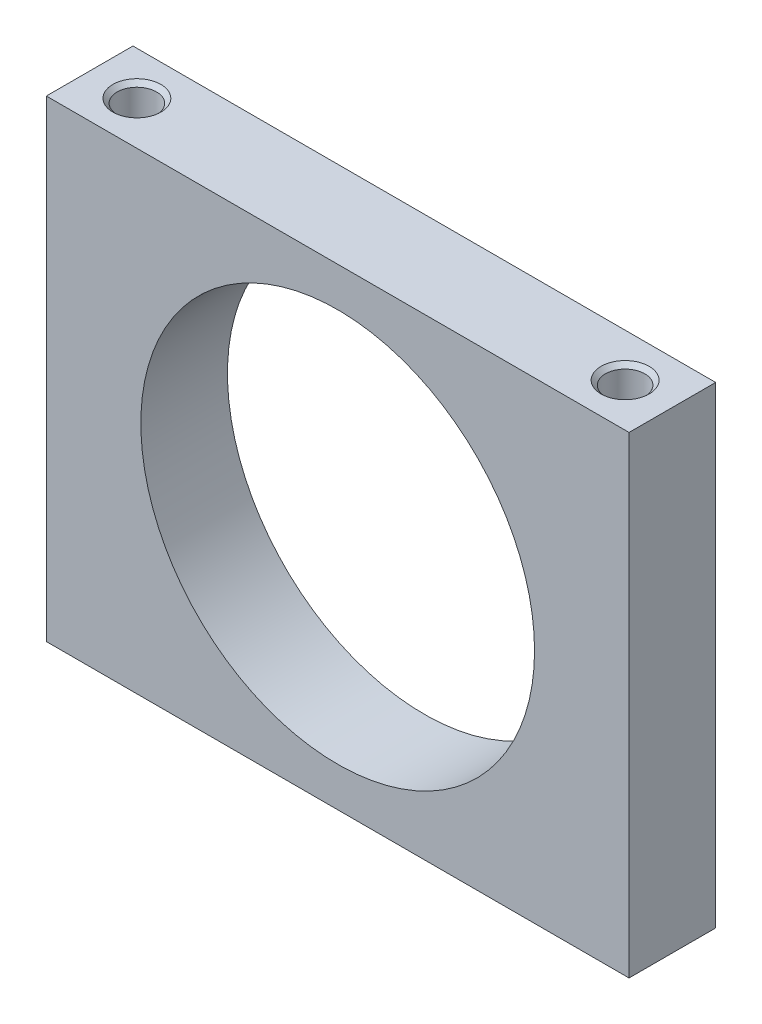
ISO-10303-21;
HEADER;
FILE_DESCRIPTION(('STEP AP214'),'2;1');
FILE_NAME('part.step','',(''),(''),'','','');
FILE_SCHEMA(('AUTOMOTIVE_DESIGN { 1 0 10303 214 1 1 1 1 }'));
ENDSEC;
DATA;
#1=APPLICATION_CONTEXT('core data for automotive mechanical design processes');
#2=APPLICATION_PROTOCOL_DEFINITION('international standard','automotive_design',2000,#1);
#3=PRODUCT_CONTEXT('',#1,'mechanical');
#4=PRODUCT('Part','Part','',(#3));
#5=PRODUCT_RELATED_PRODUCT_CATEGORY('part','',(#4));
#6=PRODUCT_DEFINITION_FORMATION('','',#4);
#7=PRODUCT_DEFINITION_CONTEXT('part definition',#1,'design');
#8=PRODUCT_DEFINITION('design','',#6,#7);
#9=PRODUCT_DEFINITION_SHAPE('','',#8);
#10=(LENGTH_UNIT() NAMED_UNIT(*) SI_UNIT(.MILLI.,.METRE.));
#11=(NAMED_UNIT(*) PLANE_ANGLE_UNIT() SI_UNIT($,.RADIAN.));
#12=(NAMED_UNIT(*) SI_UNIT($,.STERADIAN.) SOLID_ANGLE_UNIT());
#13=UNCERTAINTY_MEASURE_WITH_UNIT(LENGTH_MEASURE(1.E-05),#10,'distance_accuracy_value','');
#14=(GEOMETRIC_REPRESENTATION_CONTEXT(3) GLOBAL_UNCERTAINTY_ASSIGNED_CONTEXT((#13)) GLOBAL_UNIT_ASSIGNED_CONTEXT((#10,
#11,#12)) REPRESENTATION_CONTEXT('',''));
#15=CARTESIAN_POINT('',(0.,0.,0.));
#16=DIRECTION('',(0.,0.,1.));
#17=DIRECTION('',(1.,0.,0.));
#18=AXIS2_PLACEMENT_3D('',#15,#16,#17);
#19=CARTESIAN_POINT('',(0.,0.,5.5));
#20=DIRECTION('',(0.,0.,-1.));
#21=DIRECTION('',(-1.,0.,0.));
#22=AXIS2_PLACEMENT_3D('',#19,#20,#21);
#23=PLANE('',#22);
#24=DIRECTION('',(0.,-1.,0.));
#25=VECTOR('',#24,1.);
#26=CARTESIAN_POINT('',(-18.5,15.,5.5));
#27=LINE('',#26,#25);
#28=CARTESIAN_POINT('',(-18.5,15.,5.5));
#29=VERTEX_POINT('',#28);
#30=CARTESIAN_POINT('',(-18.5,-15.,5.5));
#31=VERTEX_POINT('',#30);
#32=EDGE_CURVE('E90',#29,#31,#27,.T.);
#33=ORIENTED_EDGE('',*,*,#32,.T.);
#34=DIRECTION('',(1.,0.,0.));
#35=VECTOR('',#34,1.);
#36=CARTESIAN_POINT('',(18.5,-15.,5.5));
#37=LINE('',#36,#35);
#38=CARTESIAN_POINT('',(18.5,-15.,5.5));
#39=VERTEX_POINT('',#38);
#40=EDGE_CURVE('E85',#31,#39,#37,.T.);
#41=ORIENTED_EDGE('',*,*,#40,.T.);
#42=DIRECTION('',(0.,1.,0.));
#43=VECTOR('',#42,1.);
#44=CARTESIAN_POINT('',(18.5,15.,5.5));
#45=LINE('',#44,#43);
#46=CARTESIAN_POINT('',(18.5,15.,5.5));
#47=VERTEX_POINT('',#46);
#48=EDGE_CURVE('E88',#39,#47,#45,.T.);
#49=ORIENTED_EDGE('',*,*,#48,.T.);
#50=DIRECTION('',(-1.,0.,0.));
#51=VECTOR('',#50,1.);
#52=CARTESIAN_POINT('',(18.5,15.,5.5));
#53=LINE('',#52,#51);
#54=EDGE_CURVE('E55',#47,#29,#53,.T.);
#55=ORIENTED_EDGE('',*,*,#54,.T.);
#56=EDGE_LOOP('',(#33,#41,#49,#55));
#57=FACE_BOUND('',#56,.T.);
#58=CARTESIAN_POINT('',(0.,0.,5.5));
#59=DIRECTION('',(0.,0.,1.));
#60=DIRECTION('',(1.,0.,0.));
#61=AXIS2_PLACEMENT_3D('',#58,#59,#60);
#62=CIRCLE('',#61,12.5);
#63=CARTESIAN_POINT('',(12.5,0.,5.5));
#64=VERTEX_POINT('',#63);
#65=EDGE_CURVE('E105',#64,#64,#62,.T.);
#66=ORIENTED_EDGE('',*,*,#65,.F.);
#67=EDGE_LOOP('',(#66));
#68=FACE_BOUND('',#67,.T.);
#69=ADVANCED_FACE('F38',(#57,#68),#23,.F.);
#70=CARTESIAN_POINT('',(0.,0.,0.));
#71=DIRECTION('',(0.,0.,-1.));
#72=DIRECTION('',(-1.,0.,0.));
#73=AXIS2_PLACEMENT_3D('',#70,#71,#72);
#74=PLANE('',#73);
#75=DIRECTION('',(0.,-1.,0.));
#76=VECTOR('',#75,1.);
#77=CARTESIAN_POINT('',(-18.5,15.,0.));
#78=LINE('',#77,#76);
#79=CARTESIAN_POINT('',(-18.5,15.,0.));
#80=VERTEX_POINT('',#79);
#81=CARTESIAN_POINT('',(-18.5,-15.,0.));
#82=VERTEX_POINT('',#81);
#83=EDGE_CURVE('E102',#80,#82,#78,.T.);
#84=ORIENTED_EDGE('',*,*,#83,.F.);
#85=DIRECTION('',(-1.,0.,0.));
#86=VECTOR('',#85,1.);
#87=CARTESIAN_POINT('',(18.5,15.,0.));
#88=LINE('',#87,#86);
#89=CARTESIAN_POINT('',(18.5,15.,0.));
#90=VERTEX_POINT('',#89);
#91=EDGE_CURVE('E78',#90,#80,#88,.T.);
#92=ORIENTED_EDGE('',*,*,#91,.F.);
#93=DIRECTION('',(0.,1.,0.));
#94=VECTOR('',#93,1.);
#95=CARTESIAN_POINT('',(18.5,15.,0.));
#96=LINE('',#95,#94);
#97=CARTESIAN_POINT('',(18.5,-15.,0.));
#98=VERTEX_POINT('',#97);
#99=EDGE_CURVE('E72',#98,#90,#96,.T.);
#100=ORIENTED_EDGE('',*,*,#99,.F.);
#101=DIRECTION('',(1.,0.,0.));
#102=VECTOR('',#101,1.);
#103=CARTESIAN_POINT('',(18.5,-15.,0.));
#104=LINE('',#103,#102);
#105=EDGE_CURVE('E94',#82,#98,#104,.T.);
#106=ORIENTED_EDGE('',*,*,#105,.F.);
#107=EDGE_LOOP('',(#84,#92,#100,#106));
#108=FACE_BOUND('',#107,.T.);
#109=CARTESIAN_POINT('',(0.,0.,0.));
#110=DIRECTION('',(0.,0.,1.));
#111=DIRECTION('',(1.,0.,0.));
#112=AXIS2_PLACEMENT_3D('',#109,#110,#111);
#113=CIRCLE('',#112,12.5);
#114=CARTESIAN_POINT('',(12.5,0.,0.));
#115=VERTEX_POINT('',#114);
#116=EDGE_CURVE('E117',#115,#115,#113,.T.);
#117=ORIENTED_EDGE('',*,*,#116,.T.);
#118=EDGE_LOOP('',(#117));
#119=FACE_BOUND('',#118,.T.);
#120=ADVANCED_FACE('F113',(#108,#119),#74,.T.);
#121=CARTESIAN_POINT('',(-18.5,15.,5.5));
#122=DIRECTION('',(1.,0.,0.));
#123=DIRECTION('',(0.,0.,-1.));
#124=AXIS2_PLACEMENT_3D('',#121,#122,#123);
#125=PLANE('',#124);
#126=ORIENTED_EDGE('',*,*,#83,.T.);
#127=DIRECTION('',(0.,0.,-1.));
#128=VECTOR('',#127,1.);
#129=CARTESIAN_POINT('',(-18.5,-15.,5.5));
#130=LINE('',#129,#128);
#131=EDGE_CURVE('E11',#31,#82,#130,.T.);
#132=ORIENTED_EDGE('',*,*,#131,.F.);
#133=ORIENTED_EDGE('',*,*,#32,.F.);
#134=DIRECTION('',(0.,0.,-1.));
#135=VECTOR('',#134,1.);
#136=CARTESIAN_POINT('',(-18.5,15.,5.5));
#137=LINE('',#136,#135);
#138=EDGE_CURVE('E98',#29,#80,#137,.T.);
#139=ORIENTED_EDGE('',*,*,#138,.T.);
#140=EDGE_LOOP('',(#126,#132,#133,#139));
#141=FACE_BOUND('',#140,.T.);
#142=ADVANCED_FACE('F40',(#141),#125,.F.);
#143=CARTESIAN_POINT('',(18.5,-15.,5.5));
#144=DIRECTION('',(0.,1.,0.));
#145=DIRECTION('',(-1.,0.,0.));
#146=AXIS2_PLACEMENT_3D('',#143,#144,#145);
#147=PLANE('',#146);
#148=CARTESIAN_POINT('',(-15.5,-15.,2.75));
#149=DIRECTION('',(0.,1.,0.));
#150=DIRECTION('',(0.,0.,1.));
#151=AXIS2_PLACEMENT_3D('',#148,#149,#150);
#152=CIRCLE('',#151,1.24999999999999);
#153=CARTESIAN_POINT('',(-15.5,-15.,3.99999999999999));
#154=VERTEX_POINT('',#153);
#155=EDGE_CURVE('E131',#154,#154,#152,.T.);
#156=ORIENTED_EDGE('',*,*,#155,.T.);
#157=EDGE_LOOP('',(#156));
#158=FACE_BOUND('',#157,.T.);
#159=CARTESIAN_POINT('',(15.5,-15.,2.75));
#160=DIRECTION('',(0.,1.,0.));
#161=DIRECTION('',(0.,0.,1.));
#162=AXIS2_PLACEMENT_3D('',#159,#160,#161);
#163=CIRCLE('',#162,1.25);
#164=CARTESIAN_POINT('',(15.5,-15.,3.99999999999999));
#165=VERTEX_POINT('',#164);
#166=EDGE_CURVE('E120',#165,#165,#163,.T.);
#167=ORIENTED_EDGE('',*,*,#166,.T.);
#168=EDGE_LOOP('',(#167));
#169=FACE_BOUND('',#168,.T.);
#170=ORIENTED_EDGE('',*,*,#105,.T.);
#171=DIRECTION('',(0.,0.,-1.));
#172=VECTOR('',#171,1.);
#173=CARTESIAN_POINT('',(18.5,-15.,5.5));
#174=LINE('',#173,#172);
#175=EDGE_CURVE('E47',#39,#98,#174,.T.);
#176=ORIENTED_EDGE('',*,*,#175,.F.);
#177=ORIENTED_EDGE('',*,*,#40,.F.);
#178=ORIENTED_EDGE('',*,*,#131,.T.);
#179=EDGE_LOOP('',(#170,#176,#177,#178));
#180=FACE_BOUND('',#179,.T.);
#181=ADVANCED_FACE('F93',(#158,#169,#180),#147,.F.);
#182=CARTESIAN_POINT('',(18.5,15.,5.5));
#183=DIRECTION('',(-1.,0.,0.));
#184=DIRECTION('',(0.,-1.,0.));
#185=AXIS2_PLACEMENT_3D('',#182,#183,#184);
#186=PLANE('',#185);
#187=ORIENTED_EDGE('',*,*,#99,.T.);
#188=DIRECTION('',(0.,0.,-1.));
#189=VECTOR('',#188,1.);
#190=CARTESIAN_POINT('',(18.5,15.,5.5));
#191=LINE('',#190,#189);
#192=EDGE_CURVE('E95',#47,#90,#191,.T.);
#193=ORIENTED_EDGE('',*,*,#192,.F.);
#194=ORIENTED_EDGE('',*,*,#48,.F.);
#195=ORIENTED_EDGE('',*,*,#175,.T.);
#196=EDGE_LOOP('',(#187,#193,#194,#195));
#197=FACE_BOUND('',#196,.T.);
#198=ADVANCED_FACE('F96',(#197),#186,.F.);
#199=CARTESIAN_POINT('',(18.5,15.,5.5));
#200=DIRECTION('',(0.,-1.,0.));
#201=DIRECTION('',(1.,0.,0.));
#202=AXIS2_PLACEMENT_3D('',#199,#200,#201);
#203=PLANE('',#202);
#204=CARTESIAN_POINT('',(-15.5,15.,2.75));
#205=DIRECTION('',(0.,1.,0.));
#206=DIRECTION('',(0.,0.,1.));
#207=AXIS2_PLACEMENT_3D('',#204,#205,#206);
#208=CIRCLE('',#207,1.525);
#209=CARTESIAN_POINT('',(-15.5,15.,4.275));
#210=VERTEX_POINT('',#209);
#211=EDGE_CURVE('E137',#210,#210,#208,.T.);
#212=ORIENTED_EDGE('',*,*,#211,.F.);
#213=EDGE_LOOP('',(#212));
#214=FACE_BOUND('',#213,.T.);
#215=CARTESIAN_POINT('',(15.5,15.,2.75));
#216=DIRECTION('',(0.,1.,0.));
#217=DIRECTION('',(0.,0.,1.));
#218=AXIS2_PLACEMENT_3D('',#215,#216,#217);
#219=CIRCLE('',#218,1.525);
#220=CARTESIAN_POINT('',(15.5,15.,4.275));
#221=VERTEX_POINT('',#220);
#222=EDGE_CURVE('E128',#221,#221,#219,.T.);
#223=ORIENTED_EDGE('',*,*,#222,.F.);
#224=EDGE_LOOP('',(#223));
#225=FACE_BOUND('',#224,.T.);
#226=ORIENTED_EDGE('',*,*,#91,.T.);
#227=ORIENTED_EDGE('',*,*,#138,.F.);
#228=ORIENTED_EDGE('',*,*,#54,.F.);
#229=ORIENTED_EDGE('',*,*,#192,.T.);
#230=EDGE_LOOP('',(#226,#227,#228,#229));
#231=FACE_BOUND('',#230,.T.);
#232=ADVANCED_FACE('F110',(#214,#225,#231),#203,.F.);
#233=CARTESIAN_POINT('',(0.,0.,5.5));
#234=DIRECTION('',(0.,0.,-1.));
#235=DIRECTION('',(-1.,0.,0.));
#236=AXIS2_PLACEMENT_3D('',#233,#234,#235);
#237=CYLINDRICAL_SURFACE('',#236,12.5);
#238=ORIENTED_EDGE('',*,*,#65,.T.);
#239=EDGE_LOOP('',(#238));
#240=FACE_BOUND('',#239,.T.);
#241=ORIENTED_EDGE('',*,*,#116,.F.);
#242=EDGE_LOOP('',(#241));
#243=FACE_BOUND('',#242,.T.);
#244=ADVANCED_FACE('F145',(#240,#243),#237,.F.);
#245=CARTESIAN_POINT('',(15.5,15.,2.75));
#246=DIRECTION('',(0.,1.,0.));
#247=DIRECTION('',(0.,0.,1.));
#248=AXIS2_PLACEMENT_3D('',#245,#246,#247);
#249=CYLINDRICAL_SURFACE('',#248,1.25);
#250=ORIENTED_EDGE('',*,*,#166,.F.);
#251=EDGE_LOOP('',(#250));
#252=FACE_BOUND('',#251,.T.);
#253=CARTESIAN_POINT('',(15.5,14.725,2.75));
#254=DIRECTION('',(0.,1.,0.));
#255=DIRECTION('',(0.,0.,1.));
#256=AXIS2_PLACEMENT_3D('',#253,#254,#255);
#257=CIRCLE('',#256,1.25);
#258=CARTESIAN_POINT('',(15.5,14.725,3.99999999999999));
#259=VERTEX_POINT('',#258);
#260=EDGE_CURVE('E125',#259,#259,#257,.T.);
#261=ORIENTED_EDGE('',*,*,#260,.T.);
#262=EDGE_LOOP('',(#261));
#263=FACE_BOUND('',#262,.T.);
#264=ADVANCED_FACE('F152',(#252,#263),#249,.F.);
#265=CARTESIAN_POINT('',(15.5,15.,2.75));
#266=DIRECTION('',(0.,1.,0.));
#267=DIRECTION('',(0.,0.,1.));
#268=AXIS2_PLACEMENT_3D('',#265,#266,#267);
#269=CONICAL_SURFACE('',#268,1.525,0.785398163397439);
#270=ORIENTED_EDGE('',*,*,#260,.F.);
#271=EDGE_LOOP('',(#270));
#272=FACE_BOUND('',#271,.T.);
#273=ORIENTED_EDGE('',*,*,#222,.T.);
#274=EDGE_LOOP('',(#273));
#275=FACE_BOUND('',#274,.T.);
#276=ADVANCED_FACE('F149',(#272,#275),#269,.F.);
#277=CARTESIAN_POINT('',(-15.5,15.,2.75));
#278=DIRECTION('',(0.,1.,0.));
#279=DIRECTION('',(0.,0.,1.));
#280=AXIS2_PLACEMENT_3D('',#277,#278,#279);
#281=CYLINDRICAL_SURFACE('',#280,1.25);
#282=ORIENTED_EDGE('',*,*,#155,.F.);
#283=EDGE_LOOP('',(#282));
#284=FACE_BOUND('',#283,.T.);
#285=CARTESIAN_POINT('',(-15.5,14.725,2.75));
#286=DIRECTION('',(0.,1.,0.));
#287=DIRECTION('',(0.,0.,1.));
#288=AXIS2_PLACEMENT_3D('',#285,#286,#287);
#289=CIRCLE('',#288,1.25);
#290=CARTESIAN_POINT('',(-15.5,14.725,4.));
#291=VERTEX_POINT('',#290);
#292=EDGE_CURVE('E134',#291,#291,#289,.T.);
#293=ORIENTED_EDGE('',*,*,#292,.T.);
#294=EDGE_LOOP('',(#293));
#295=FACE_BOUND('',#294,.T.);
#296=ADVANCED_FACE('F151',(#284,#295),#281,.F.);
#297=CARTESIAN_POINT('',(-15.5,15.,2.75));
#298=DIRECTION('',(0.,1.,0.));
#299=DIRECTION('',(0.,0.,1.));
#300=AXIS2_PLACEMENT_3D('',#297,#298,#299);
#301=CONICAL_SURFACE('',#300,1.525,0.785398163397439);
#302=ORIENTED_EDGE('',*,*,#292,.F.);
#303=EDGE_LOOP('',(#302));
#304=FACE_BOUND('',#303,.T.);
#305=ORIENTED_EDGE('',*,*,#211,.T.);
#306=EDGE_LOOP('',(#305));
#307=FACE_BOUND('',#306,.T.);
#308=ADVANCED_FACE('F141',(#304,#307),#301,.F.);
#309=CLOSED_SHELL('',(#69,#120,#142,#181,#198,#232,#244,#264,#276,#296,#308));
#310=MANIFOLD_SOLID_BREP('B2',#309);
#311=ADVANCED_BREP_SHAPE_REPRESENTATION('',(#18,#310),#14);
#312=SHAPE_DEFINITION_REPRESENTATION(#9,#311);
ENDSEC;
END-ISO-10303-21;
